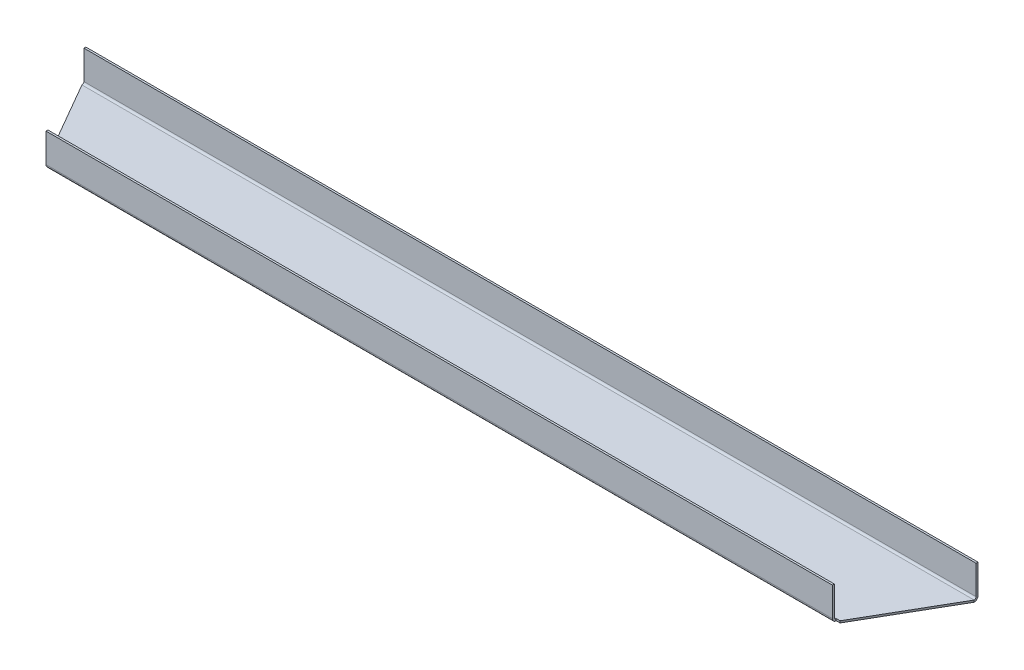
ISO-10303-21;
HEADER;
FILE_DESCRIPTION(('STEP AP214'),'2;1');
FILE_NAME('part.step','',(''),(''),'','','');
FILE_SCHEMA(('AUTOMOTIVE_DESIGN { 1 0 10303 214 1 1 1 1 }'));
ENDSEC;
DATA;
#1=APPLICATION_CONTEXT('core data for automotive mechanical design processes');
#2=APPLICATION_PROTOCOL_DEFINITION('international standard','automotive_design',2000,#1);
#3=PRODUCT_CONTEXT('',#1,'mechanical');
#4=PRODUCT('Part','Part','',(#3));
#5=PRODUCT_RELATED_PRODUCT_CATEGORY('part','',(#4));
#6=PRODUCT_DEFINITION_FORMATION('','',#4);
#7=PRODUCT_DEFINITION_CONTEXT('part definition',#1,'design');
#8=PRODUCT_DEFINITION('design','',#6,#7);
#9=PRODUCT_DEFINITION_SHAPE('','',#8);
#10=(LENGTH_UNIT() NAMED_UNIT(*) SI_UNIT(.MILLI.,.METRE.));
#11=(NAMED_UNIT(*) PLANE_ANGLE_UNIT() SI_UNIT($,.RADIAN.));
#12=(NAMED_UNIT(*) SI_UNIT($,.STERADIAN.) SOLID_ANGLE_UNIT());
#13=UNCERTAINTY_MEASURE_WITH_UNIT(LENGTH_MEASURE(1.E-05),#10,'distance_accuracy_value','');
#14=(GEOMETRIC_REPRESENTATION_CONTEXT(3) GLOBAL_UNCERTAINTY_ASSIGNED_CONTEXT((#13)) GLOBAL_UNIT_ASSIGNED_CONTEXT((#10,
#11,#12)) REPRESENTATION_CONTEXT('',''));
#15=CARTESIAN_POINT('',(0.,0.,0.));
#16=DIRECTION('',(0.,0.,1.));
#17=DIRECTION('',(1.,0.,0.));
#18=AXIS2_PLACEMENT_3D('',#15,#16,#17);
#19=CARTESIAN_POINT('',(-646.229009265076,6.35,149.225));
#20=DIRECTION('',(0.,0.,-1.));
#21=DIRECTION('',(-1.,0.,0.));
#22=AXIS2_PLACEMENT_3D('',#19,#20,#21);
#23=PLANE('',#22);
#24=DIRECTION('',(0.,1.,0.));
#25=VECTOR('',#24,1.);
#26=CARTESIAN_POINT('',(646.229009265076,30.1625,149.225));
#27=LINE('',#26,#25);
#28=CARTESIAN_POINT('',(646.229009265076,53.975,149.225));
#29=VERTEX_POINT('',#28);
#30=CARTESIAN_POINT('',(646.229009265076,6.35,149.225));
#31=VERTEX_POINT('',#30);
#32=EDGE_CURVE('E230',#29,#31,#27,.F.);
#33=ORIENTED_EDGE('',*,*,#32,.T.);
#34=DIRECTION('',(1.,0.,0.));
#35=VECTOR('',#34,1.);
#36=CARTESIAN_POINT('',(-646.229009265076,6.35,149.225));
#37=LINE('',#36,#35);
#38=CARTESIAN_POINT('',(-646.229009265076,6.35,149.225));
#39=VERTEX_POINT('',#38);
#40=EDGE_CURVE('E220',#31,#39,#37,.F.);
#41=ORIENTED_EDGE('',*,*,#40,.T.);
#42=DIRECTION('',(0.,1.,0.));
#43=VECTOR('',#42,1.);
#44=CARTESIAN_POINT('',(-646.229009265076,30.1625,149.225));
#45=LINE('',#44,#43);
#46=CARTESIAN_POINT('',(-646.229009265076,53.975,149.225));
#47=VERTEX_POINT('',#46);
#48=EDGE_CURVE('E221',#39,#47,#45,.T.);
#49=ORIENTED_EDGE('',*,*,#48,.T.);
#50=DIRECTION('',(1.,0.,0.));
#51=VECTOR('',#50,1.);
#52=CARTESIAN_POINT('',(-5.4143356464912E-13,53.975,149.225));
#53=LINE('',#52,#51);
#54=EDGE_CURVE('E231',#47,#29,#53,.T.);
#55=ORIENTED_EDGE('',*,*,#54,.T.);
#56=EDGE_LOOP('',(#33,#41,#49,#55));
#57=FACE_BOUND('',#56,.T.);
#58=ADVANCED_FACE('F33',(#57),#23,.T.);
#59=CARTESIAN_POINT('',(733.234841870792,6.35,3.175));
#60=DIRECTION('',(0.,0.,1.));
#61=DIRECTION('',(1.,0.,0.));
#62=AXIS2_PLACEMENT_3D('',#59,#60,#61);
#63=PLANE('',#62);
#64=DIRECTION('',(0.,1.,0.));
#65=VECTOR('',#64,1.);
#66=CARTESIAN_POINT('',(-733.234841870792,30.1625,3.175));
#67=LINE('',#66,#65);
#68=CARTESIAN_POINT('',(-733.234841870792,53.975,3.175));
#69=VERTEX_POINT('',#68);
#70=CARTESIAN_POINT('',(-733.234841870792,6.35,3.175));
#71=VERTEX_POINT('',#70);
#72=EDGE_CURVE('E247',#69,#71,#67,.F.);
#73=ORIENTED_EDGE('',*,*,#72,.T.);
#74=DIRECTION('',(-1.,0.,0.));
#75=VECTOR('',#74,1.);
#76=CARTESIAN_POINT('',(733.234841870792,6.35,3.175));
#77=LINE('',#76,#75);
#78=CARTESIAN_POINT('',(733.234841870792,6.35,3.175));
#79=VERTEX_POINT('',#78);
#80=EDGE_CURVE('E236',#71,#79,#77,.F.);
#81=ORIENTED_EDGE('',*,*,#80,.T.);
#82=DIRECTION('',(0.,1.,0.));
#83=VECTOR('',#82,1.);
#84=CARTESIAN_POINT('',(733.234841870792,30.1625,3.175));
#85=LINE('',#84,#83);
#86=CARTESIAN_POINT('',(733.234841870792,53.975,3.175));
#87=VERTEX_POINT('',#86);
#88=EDGE_CURVE('E256',#79,#87,#85,.T.);
#89=ORIENTED_EDGE('',*,*,#88,.T.);
#90=DIRECTION('',(1.,0.,0.));
#91=VECTOR('',#90,1.);
#92=CARTESIAN_POINT('',(0.,53.975,3.175));
#93=LINE('',#92,#91);
#94=EDGE_CURVE('E269',#87,#69,#93,.F.);
#95=ORIENTED_EDGE('',*,*,#94,.T.);
#96=EDGE_LOOP('',(#73,#81,#89,#95));
#97=FACE_BOUND('',#96,.T.);
#98=ADVANCED_FACE('F278',(#97),#63,.T.);
#99=CARTESIAN_POINT('',(0.,53.975,1.5875));
#100=DIRECTION('',(0.,-1.,0.));
#101=DIRECTION('',(0.,0.,-1.));
#102=AXIS2_PLACEMENT_3D('',#99,#100,#101);
#103=PLANE('',#102);
#104=DIRECTION('',(0.,0.,-1.));
#105=VECTOR('',#104,1.);
#106=CARTESIAN_POINT('',(-733.234841870792,53.975,1.5875));
#107=LINE('',#106,#105);
#108=CARTESIAN_POINT('',(-733.234841870792,53.975,0.));
#109=VERTEX_POINT('',#108);
#110=EDGE_CURVE('E250',#109,#69,#107,.F.);
#111=ORIENTED_EDGE('',*,*,#110,.T.);
#112=ORIENTED_EDGE('',*,*,#94,.F.);
#113=DIRECTION('',(0.,0.,1.));
#114=VECTOR('',#113,1.);
#115=CARTESIAN_POINT('',(733.234841870792,53.975,1.5875));
#116=LINE('',#115,#114);
#117=CARTESIAN_POINT('',(733.234841870792,53.975,0.));
#118=VERTEX_POINT('',#117);
#119=EDGE_CURVE('E253',#87,#118,#116,.F.);
#120=ORIENTED_EDGE('',*,*,#119,.T.);
#121=DIRECTION('',(1.,0.,0.));
#122=VECTOR('',#121,1.);
#123=CARTESIAN_POINT('',(733.234841870792,53.975,0.));
#124=LINE('',#123,#122);
#125=EDGE_CURVE('E190',#118,#109,#124,.F.);
#126=ORIENTED_EDGE('',*,*,#125,.T.);
#127=EDGE_LOOP('',(#111,#112,#120,#126));
#128=FACE_BOUND('',#127,.T.);
#129=ADVANCED_FACE('F283',(#128),#103,.F.);
#130=CARTESIAN_POINT('',(-5.4143356464912E-13,53.975,150.8125));
#131=DIRECTION('',(0.,-1.,0.));
#132=DIRECTION('',(0.,0.,-1.));
#133=AXIS2_PLACEMENT_3D('',#130,#131,#132);
#134=PLANE('',#133);
#135=DIRECTION('',(0.,0.,1.));
#136=VECTOR('',#135,1.);
#137=CARTESIAN_POINT('',(646.229009265076,53.975,150.8125));
#138=LINE('',#137,#136);
#139=CARTESIAN_POINT('',(646.229009265076,53.975,152.4));
#140=VERTEX_POINT('',#139);
#141=EDGE_CURVE('E227',#140,#29,#138,.F.);
#142=ORIENTED_EDGE('',*,*,#141,.T.);
#143=ORIENTED_EDGE('',*,*,#54,.F.);
#144=DIRECTION('',(0.,0.,-1.));
#145=VECTOR('',#144,1.);
#146=CARTESIAN_POINT('',(-646.229009265076,53.975,150.8125));
#147=LINE('',#146,#145);
#148=CARTESIAN_POINT('',(-646.229009265076,53.975,152.4));
#149=VERTEX_POINT('',#148);
#150=EDGE_CURVE('E218',#47,#149,#147,.F.);
#151=ORIENTED_EDGE('',*,*,#150,.T.);
#152=DIRECTION('',(-1.,0.,0.));
#153=VECTOR('',#152,1.);
#154=CARTESIAN_POINT('',(-646.229009265076,53.975,152.4));
#155=LINE('',#154,#153);
#156=EDGE_CURVE('E147',#149,#140,#155,.F.);
#157=ORIENTED_EDGE('',*,*,#156,.T.);
#158=EDGE_LOOP('',(#142,#143,#151,#157));
#159=FACE_BOUND('',#158,.T.);
#160=ADVANCED_FACE('F436',(#159),#134,.F.);
#161=CARTESIAN_POINT('',(-646.229009265076,6.35,146.05));
#162=DIRECTION('',(1.,0.,0.));
#163=DIRECTION('',(0.,0.,-1.));
#164=AXIS2_PLACEMENT_3D('',#161,#162,#163);
#165=CYLINDRICAL_SURFACE('',#164,3.175);
#166=ORIENTED_EDGE('',*,*,#40,.F.);
#167=CARTESIAN_POINT('',(646.229009265076,6.35,146.05));
#168=DIRECTION('',(1.,0.,0.));
#169=DIRECTION('',(0.,0.,-1.));
#170=AXIS2_PLACEMENT_3D('',#167,#168,#169);
#171=CIRCLE('',#170,3.175);
#172=CARTESIAN_POINT('',(646.229009265076,3.175,146.050000000013));
#173=VERTEX_POINT('',#172);
#174=EDGE_CURVE('E173',#31,#173,#171,.T.);
#175=ORIENTED_EDGE('',*,*,#174,.T.);
#176=DIRECTION('',(1.,0.,0.));
#177=VECTOR('',#176,1.);
#178=CARTESIAN_POINT('',(0.,3.175,146.05));
#179=LINE('',#178,#177);
#180=CARTESIAN_POINT('',(-646.229009265076,3.175,146.050000000013));
#181=VERTEX_POINT('',#180);
#182=EDGE_CURVE('E151',#181,#173,#179,.T.);
#183=ORIENTED_EDGE('',*,*,#182,.F.);
#184=CARTESIAN_POINT('',(-646.229009265076,6.35,146.05));
#185=DIRECTION('',(1.,0.,0.));
#186=DIRECTION('',(0.,0.,-1.));
#187=AXIS2_PLACEMENT_3D('',#184,#185,#186);
#188=CIRCLE('',#187,3.175);
#189=EDGE_CURVE('E176',#181,#39,#188,.F.);
#190=ORIENTED_EDGE('',*,*,#189,.T.);
#191=EDGE_LOOP('',(#166,#175,#183,#190));
#192=FACE_BOUND('',#191,.T.);
#193=ADVANCED_FACE('F445',(#192),#165,.F.);
#194=CARTESIAN_POINT('',(733.234841870792,6.35,6.35));
#195=DIRECTION('',(-1.,0.,0.));
#196=DIRECTION('',(0.,0.,1.));
#197=AXIS2_PLACEMENT_3D('',#194,#195,#196);
#198=CYLINDRICAL_SURFACE('',#197,3.175);
#199=ORIENTED_EDGE('',*,*,#80,.F.);
#200=CARTESIAN_POINT('',(-733.234841870792,6.35,6.35));
#201=DIRECTION('',(-1.,0.,0.));
#202=DIRECTION('',(0.,0.,1.));
#203=AXIS2_PLACEMENT_3D('',#200,#201,#202);
#204=CIRCLE('',#203,3.175);
#205=CARTESIAN_POINT('',(-733.234841870826,3.175,6.35000000006615));
#206=VERTEX_POINT('',#205);
#207=EDGE_CURVE('E178',#71,#206,#204,.T.);
#208=ORIENTED_EDGE('',*,*,#207,.T.);
#209=DIRECTION('',(1.,0.,0.));
#210=VECTOR('',#209,1.);
#211=CARTESIAN_POINT('',(0.,3.175,6.35000000000762));
#212=LINE('',#211,#210);
#213=CARTESIAN_POINT('',(733.234841870826,3.175,6.35000000002227));
#214=VERTEX_POINT('',#213);
#215=EDGE_CURVE('E215',#214,#206,#212,.F.);
#216=ORIENTED_EDGE('',*,*,#215,.F.);
#217=CARTESIAN_POINT('',(733.234841870792,6.35,6.35));
#218=DIRECTION('',(-1.,0.,0.));
#219=DIRECTION('',(0.,0.,1.));
#220=AXIS2_PLACEMENT_3D('',#217,#218,#219);
#221=CIRCLE('',#220,3.175);
#222=EDGE_CURVE('E36',#214,#79,#221,.F.);
#223=ORIENTED_EDGE('',*,*,#222,.T.);
#224=EDGE_LOOP('',(#199,#208,#216,#223));
#225=FACE_BOUND('',#224,.T.);
#226=ADVANCED_FACE('F455',(#225),#198,.F.);
#227=CARTESIAN_POINT('',(733.234841870792,2.9824039545985,2.9824039545985));
#228=DIRECTION('',(-1.,0.,0.));
#229=DIRECTION('',(0.,0.,1.));
#230=AXIS2_PLACEMENT_3D('',#227,#228,#229);
#231=PLANE('',#230);
#232=CARTESIAN_POINT('',(733.234841870792,6.35,6.35));
#233=DIRECTION('',(-1.,0.,0.));
#234=DIRECTION('',(0.,0.,1.));
#235=AXIS2_PLACEMENT_3D('',#232,#233,#234);
#236=CIRCLE('',#235,6.35);
#237=CARTESIAN_POINT('',(733.234841870792,6.35,0.));
#238=VERTEX_POINT('',#237);
#239=CARTESIAN_POINT('',(733.234841870817,0.,6.35000000001495));
#240=VERTEX_POINT('',#239);
#241=EDGE_CURVE('E170',#238,#240,#236,.T.);
#242=ORIENTED_EDGE('',*,*,#241,.F.);
#243=DIRECTION('',(0.,1.,0.));
#244=VECTOR('',#243,1.);
#245=CARTESIAN_POINT('',(733.234841870792,6.35,0.));
#246=LINE('',#245,#244);
#247=EDGE_CURVE('E180',#238,#118,#246,.T.);
#248=ORIENTED_EDGE('',*,*,#247,.T.);
#249=ORIENTED_EDGE('',*,*,#119,.F.);
#250=ORIENTED_EDGE('',*,*,#88,.F.);
#251=ORIENTED_EDGE('',*,*,#222,.F.);
#252=DIRECTION('',(0.,1.,0.));
#253=VECTOR('',#252,1.);
#254=CARTESIAN_POINT('',(733.234841870843,1.5875,6.3500000000369));
#255=LINE('',#254,#253);
#256=EDGE_CURVE('E172',#214,#240,#255,.F.);
#257=ORIENTED_EDGE('',*,*,#256,.T.);
#258=EDGE_LOOP('',(#242,#248,#249,#250,#251,#257));
#259=FACE_BOUND('',#258,.T.);
#260=ADVANCED_FACE('F328',(#259),#231,.F.);
#261=CARTESIAN_POINT('',(733.234841870792,6.35,0.));
#262=DIRECTION('',(0.,0.,1.));
#263=DIRECTION('',(1.,0.,0.));
#264=AXIS2_PLACEMENT_3D('',#261,#262,#263);
#265=PLANE('',#264);
#266=DIRECTION('',(-1.,0.,0.));
#267=VECTOR('',#266,1.);
#268=CARTESIAN_POINT('',(733.234841870792,6.35,0.));
#269=LINE('',#268,#267);
#270=CARTESIAN_POINT('',(-733.234841870792,6.35,0.));
#271=VERTEX_POINT('',#270);
#272=EDGE_CURVE('E169',#271,#238,#269,.F.);
#273=ORIENTED_EDGE('',*,*,#272,.F.);
#274=DIRECTION('',(0.,1.,0.));
#275=VECTOR('',#274,1.);
#276=CARTESIAN_POINT('',(-733.234841870792,6.35,0.));
#277=LINE('',#276,#275);
#278=EDGE_CURVE('E185',#109,#271,#277,.F.);
#279=ORIENTED_EDGE('',*,*,#278,.F.);
#280=ORIENTED_EDGE('',*,*,#125,.F.);
#281=ORIENTED_EDGE('',*,*,#247,.F.);
#282=EDGE_LOOP('',(#273,#279,#280,#281));
#283=FACE_BOUND('',#282,.T.);
#284=ADVANCED_FACE('F286',(#283),#265,.F.);
#285=CARTESIAN_POINT('',(-733.234841870792,2.9824039545985,2.9824039545985));
#286=DIRECTION('',(1.,0.,0.));
#287=DIRECTION('',(0.,0.,-1.));
#288=AXIS2_PLACEMENT_3D('',#285,#286,#287);
#289=PLANE('',#288);
#290=DIRECTION('',(0.,1.,0.));
#291=VECTOR('',#290,1.);
#292=CARTESIAN_POINT('',(-733.234841870843,1.5875,6.3500000000369));
#293=LINE('',#292,#291);
#294=CARTESIAN_POINT('',(-733.234841870817,0.,6.35000000001494));
#295=VERTEX_POINT('',#294);
#296=EDGE_CURVE('E290',#295,#206,#293,.T.);
#297=ORIENTED_EDGE('',*,*,#296,.T.);
#298=ORIENTED_EDGE('',*,*,#207,.F.);
#299=ORIENTED_EDGE('',*,*,#72,.F.);
#300=ORIENTED_EDGE('',*,*,#110,.F.);
#301=ORIENTED_EDGE('',*,*,#278,.T.);
#302=CARTESIAN_POINT('',(-733.234841870792,6.35,6.35));
#303=DIRECTION('',(-1.,0.,0.));
#304=DIRECTION('',(0.,0.,1.));
#305=AXIS2_PLACEMENT_3D('',#302,#303,#304);
#306=CIRCLE('',#305,6.35);
#307=EDGE_CURVE('E167',#295,#271,#306,.F.);
#308=ORIENTED_EDGE('',*,*,#307,.F.);
#309=EDGE_LOOP('',(#297,#298,#299,#300,#301,#308));
#310=FACE_BOUND('',#309,.T.);
#311=ADVANCED_FACE('F281',(#310),#289,.F.);
#312=CARTESIAN_POINT('',(-646.229009265076,2.9824039545985,149.417596045414));
#313=DIRECTION('',(1.,0.,0.));
#314=DIRECTION('',(0.,0.,-1.));
#315=AXIS2_PLACEMENT_3D('',#312,#313,#314);
#316=PLANE('',#315);
#317=CARTESIAN_POINT('',(-646.229009265076,6.35,146.05));
#318=DIRECTION('',(1.,0.,0.));
#319=DIRECTION('',(0.,0.,-1.));
#320=AXIS2_PLACEMENT_3D('',#317,#318,#319);
#321=CIRCLE('',#320,6.35);
#322=CARTESIAN_POINT('',(-646.229009265076,6.35,152.4));
#323=VERTEX_POINT('',#322);
#324=CARTESIAN_POINT('',(-646.229009265076,0.,146.050000000013));
#325=VERTEX_POINT('',#324);
#326=EDGE_CURVE('E50',#323,#325,#321,.T.);
#327=ORIENTED_EDGE('',*,*,#326,.F.);
#328=DIRECTION('',(0.,1.,0.));
#329=VECTOR('',#328,1.);
#330=CARTESIAN_POINT('',(-646.229009265076,6.35,152.4));
#331=LINE('',#330,#329);
#332=EDGE_CURVE('E142',#323,#149,#331,.T.);
#333=ORIENTED_EDGE('',*,*,#332,.T.);
#334=ORIENTED_EDGE('',*,*,#150,.F.);
#335=ORIENTED_EDGE('',*,*,#48,.F.);
#336=ORIENTED_EDGE('',*,*,#189,.F.);
#337=DIRECTION('',(0.,1.,0.));
#338=VECTOR('',#337,1.);
#339=CARTESIAN_POINT('',(-646.229009265076,1.5875,146.050000000025));
#340=LINE('',#339,#338);
#341=EDGE_CURVE('E159',#181,#325,#340,.F.);
#342=ORIENTED_EDGE('',*,*,#341,.T.);
#343=EDGE_LOOP('',(#327,#333,#334,#335,#336,#342));
#344=FACE_BOUND('',#343,.T.);
#345=ADVANCED_FACE('F157',(#344),#316,.F.);
#346=CARTESIAN_POINT('',(646.229009265076,2.9824039545985,149.417596045414));
#347=DIRECTION('',(-1.,0.,0.));
#348=DIRECTION('',(0.,0.,1.));
#349=AXIS2_PLACEMENT_3D('',#346,#347,#348);
#350=PLANE('',#349);
#351=DIRECTION('',(0.,1.,0.));
#352=VECTOR('',#351,1.);
#353=CARTESIAN_POINT('',(646.229009265076,1.5875,146.050000000025));
#354=LINE('',#353,#352);
#355=CARTESIAN_POINT('',(646.229009265076,0.,146.050000000013));
#356=VERTEX_POINT('',#355);
#357=EDGE_CURVE('E211',#356,#173,#354,.T.);
#358=ORIENTED_EDGE('',*,*,#357,.T.);
#359=ORIENTED_EDGE('',*,*,#174,.F.);
#360=ORIENTED_EDGE('',*,*,#32,.F.);
#361=ORIENTED_EDGE('',*,*,#141,.F.);
#362=DIRECTION('',(0.,1.,0.));
#363=VECTOR('',#362,1.);
#364=CARTESIAN_POINT('',(646.229009265076,6.35,152.4));
#365=LINE('',#364,#363);
#366=CARTESIAN_POINT('',(646.229009265076,6.35,152.4));
#367=VERTEX_POINT('',#366);
#368=EDGE_CURVE('E152',#140,#367,#365,.F.);
#369=ORIENTED_EDGE('',*,*,#368,.T.);
#370=CARTESIAN_POINT('',(646.229009265076,6.35,146.05));
#371=DIRECTION('',(1.,0.,0.));
#372=DIRECTION('',(0.,0.,-1.));
#373=AXIS2_PLACEMENT_3D('',#370,#371,#372);
#374=CIRCLE('',#373,6.35);
#375=EDGE_CURVE('E136',#356,#367,#374,.F.);
#376=ORIENTED_EDGE('',*,*,#375,.F.);
#377=EDGE_LOOP('',(#358,#359,#360,#361,#369,#376));
#378=FACE_BOUND('',#377,.T.);
#379=ADVANCED_FACE('F343',(#378),#350,.F.);
#380=CARTESIAN_POINT('',(-646.229009265076,6.35,152.4));
#381=DIRECTION('',(0.,0.,-1.));
#382=DIRECTION('',(-1.,0.,0.));
#383=AXIS2_PLACEMENT_3D('',#380,#381,#382);
#384=PLANE('',#383);
#385=DIRECTION('',(1.,0.,0.));
#386=VECTOR('',#385,1.);
#387=CARTESIAN_POINT('',(-646.229009265076,6.35,152.4));
#388=LINE('',#387,#386);
#389=EDGE_CURVE('E145',#367,#323,#388,.F.);
#390=ORIENTED_EDGE('',*,*,#389,.F.);
#391=ORIENTED_EDGE('',*,*,#368,.F.);
#392=ORIENTED_EDGE('',*,*,#156,.F.);
#393=ORIENTED_EDGE('',*,*,#332,.F.);
#394=EDGE_LOOP('',(#390,#391,#392,#393));
#395=FACE_BOUND('',#394,.T.);
#396=ADVANCED_FACE('F143',(#395),#384,.F.);
#397=CARTESIAN_POINT('',(0.,3.175,0.));
#398=DIRECTION('',(0.,1.,0.));
#399=DIRECTION('',(0.,0.,1.));
#400=AXIS2_PLACEMENT_3D('',#397,#398,#399);
#401=PLANE('',#400);
#402=DIRECTION('',(-0.500000000000017,0.,-0.866025403784429));
#403=VECTOR('',#402,1.);
#404=CARTESIAN_POINT('',(-694.740012672644,3.175,73.025));
#405=LINE('',#404,#403);
#406=CARTESIAN_POINT('',(-652.579009265071,3.175,146.050000000022));
#407=VERTEX_POINT('',#406);
#408=EDGE_CURVE('E323',#206,#407,#405,.F.);
#409=ORIENTED_EDGE('',*,*,#408,.T.);
#410=DIRECTION('',(-1.,0.,0.));
#411=VECTOR('',#410,1.);
#412=CARTESIAN_POINT('',(-649.404009265076,3.175,146.050000000025));
#413=LINE('',#412,#411);
#414=EDGE_CURVE('E163',#407,#181,#413,.F.);
#415=ORIENTED_EDGE('',*,*,#414,.T.);
#416=ORIENTED_EDGE('',*,*,#182,.T.);
#417=DIRECTION('',(-1.,0.,0.));
#418=VECTOR('',#417,1.);
#419=CARTESIAN_POINT('',(649.404009265076,3.175,146.050000000025));
#420=LINE('',#419,#418);
#421=CARTESIAN_POINT('',(652.579009265065,3.175,146.050000000019));
#422=VERTEX_POINT('',#421);
#423=EDGE_CURVE('E105',#173,#422,#420,.F.);
#424=ORIENTED_EDGE('',*,*,#423,.T.);
#425=DIRECTION('',(-0.500000000000017,0.,0.866025403784429));
#426=VECTOR('',#425,1.);
#427=CARTESIAN_POINT('',(694.740012672644,3.175,73.025));
#428=LINE('',#427,#426);
#429=EDGE_CURVE('E198',#422,#214,#428,.F.);
#430=ORIENTED_EDGE('',*,*,#429,.T.);
#431=ORIENTED_EDGE('',*,*,#215,.T.);
#432=EDGE_LOOP('',(#409,#415,#416,#424,#430,#431));
#433=FACE_BOUND('',#432,.T.);
#434=ADVANCED_FACE('F333',(#433),#401,.T.);
#435=CARTESIAN_POINT('',(649.404009265076,1.5875,146.050000000025));
#436=DIRECTION('',(0.,0.,-1.));
#437=DIRECTION('',(-1.,0.,0.));
#438=AXIS2_PLACEMENT_3D('',#435,#436,#437);
#439=PLANE('',#438);
#440=DIRECTION('',(1.,0.,0.));
#441=VECTOR('',#440,1.);
#442=CARTESIAN_POINT('',(0.,0.,146.05));
#443=LINE('',#442,#441);
#444=CARTESIAN_POINT('',(652.579009265072,0.,146.050000000012));
#445=VERTEX_POINT('',#444);
#446=EDGE_CURVE('E155',#356,#445,#443,.T.);
#447=ORIENTED_EDGE('',*,*,#446,.T.);
#448=DIRECTION('',(0.,1.,0.));
#449=VECTOR('',#448,1.);
#450=CARTESIAN_POINT('',(652.57900926506,1.5875,146.050000000016));
#451=LINE('',#450,#449);
#452=EDGE_CURVE('E206',#445,#422,#451,.T.);
#453=ORIENTED_EDGE('',*,*,#452,.T.);
#454=ORIENTED_EDGE('',*,*,#423,.F.);
#455=ORIENTED_EDGE('',*,*,#357,.F.);
#456=EDGE_LOOP('',(#447,#453,#454,#455));
#457=FACE_BOUND('',#456,.T.);
#458=ADVANCED_FACE('F335',(#457),#439,.F.);
#459=CARTESIAN_POINT('',(694.740012672644,1.5875,73.025));
#460=DIRECTION('',(-0.866025403784429,0.,-0.500000000000017));
#461=DIRECTION('',(-0.500000000000017,0.,0.866025403784429));
#462=AXIS2_PLACEMENT_3D('',#459,#460,#461);
#463=PLANE('',#462);
#464=ORIENTED_EDGE('',*,*,#429,.F.);
#465=ORIENTED_EDGE('',*,*,#452,.F.);
#466=DIRECTION('',(0.499999999999605,0.,-0.866025403784667));
#467=VECTOR('',#466,1.);
#468=CARTESIAN_POINT('',(652.579009265076,0.,146.050000000025));
#469=LINE('',#468,#467);
#470=EDGE_CURVE('E199',#445,#240,#469,.T.);
#471=ORIENTED_EDGE('',*,*,#470,.T.);
#472=ORIENTED_EDGE('',*,*,#256,.F.);
#473=EDGE_LOOP('',(#464,#465,#471,#472));
#474=FACE_BOUND('',#473,.T.);
#475=ADVANCED_FACE('F331',(#474),#463,.F.);
#476=CARTESIAN_POINT('',(733.234841870792,6.35,6.35));
#477=DIRECTION('',(-1.,0.,0.));
#478=DIRECTION('',(0.,0.,1.));
#479=AXIS2_PLACEMENT_3D('',#476,#477,#478);
#480=CYLINDRICAL_SURFACE('',#479,6.35);
#481=ORIENTED_EDGE('',*,*,#307,.T.);
#482=ORIENTED_EDGE('',*,*,#272,.T.);
#483=ORIENTED_EDGE('',*,*,#241,.T.);
#484=DIRECTION('',(1.,0.,0.));
#485=VECTOR('',#484,1.);
#486=CARTESIAN_POINT('',(0.,0.,6.35000000000762));
#487=LINE('',#486,#485);
#488=EDGE_CURVE('E202',#240,#295,#487,.F.);
#489=ORIENTED_EDGE('',*,*,#488,.T.);
#490=EDGE_LOOP('',(#481,#482,#483,#489));
#491=FACE_BOUND('',#490,.T.);
#492=ADVANCED_FACE('F304',(#491),#480,.T.);
#493=CARTESIAN_POINT('',(-694.740012672644,1.5875,73.025));
#494=DIRECTION('',(0.866025403784429,0.,-0.500000000000017));
#495=DIRECTION('',(-0.500000000000017,0.,-0.866025403784429));
#496=AXIS2_PLACEMENT_3D('',#493,#494,#495);
#497=PLANE('',#496);
#498=DIRECTION('',(0.499999999999605,0.,0.866025403784667));
#499=VECTOR('',#498,1.);
#500=CARTESIAN_POINT('',(-733.234841870792,0.,6.35000000000762));
#501=LINE('',#500,#499);
#502=CARTESIAN_POINT('',(-652.579009265072,0.,146.050000000025));
#503=VERTEX_POINT('',#502);
#504=EDGE_CURVE('E297',#295,#503,#501,.T.);
#505=ORIENTED_EDGE('',*,*,#504,.T.);
#506=DIRECTION('',(0.,1.,0.));
#507=VECTOR('',#506,1.);
#508=CARTESIAN_POINT('',(-652.579009265076,1.5875,146.050000000025));
#509=LINE('',#508,#507);
#510=EDGE_CURVE('E319',#503,#407,#509,.T.);
#511=ORIENTED_EDGE('',*,*,#510,.T.);
#512=ORIENTED_EDGE('',*,*,#408,.F.);
#513=ORIENTED_EDGE('',*,*,#296,.F.);
#514=EDGE_LOOP('',(#505,#511,#512,#513));
#515=FACE_BOUND('',#514,.T.);
#516=ADVANCED_FACE('F355',(#515),#497,.F.);
#517=CARTESIAN_POINT('',(-649.404009265076,1.5875,146.050000000025));
#518=DIRECTION('',(0.,0.,-1.));
#519=DIRECTION('',(-1.,0.,0.));
#520=AXIS2_PLACEMENT_3D('',#517,#518,#519);
#521=PLANE('',#520);
#522=ORIENTED_EDGE('',*,*,#414,.F.);
#523=ORIENTED_EDGE('',*,*,#510,.F.);
#524=DIRECTION('',(1.,0.,0.));
#525=VECTOR('',#524,1.);
#526=CARTESIAN_POINT('',(0.,0.,146.050000000025));
#527=LINE('',#526,#525);
#528=EDGE_CURVE('E42',#503,#325,#527,.T.);
#529=ORIENTED_EDGE('',*,*,#528,.T.);
#530=ORIENTED_EDGE('',*,*,#341,.F.);
#531=EDGE_LOOP('',(#522,#523,#529,#530));
#532=FACE_BOUND('',#531,.T.);
#533=ADVANCED_FACE('F350',(#532),#521,.F.);
#534=CARTESIAN_POINT('',(-646.229009265076,6.35,146.05));
#535=DIRECTION('',(1.,0.,0.));
#536=DIRECTION('',(0.,0.,-1.));
#537=AXIS2_PLACEMENT_3D('',#534,#535,#536);
#538=CYLINDRICAL_SURFACE('',#537,6.35);
#539=ORIENTED_EDGE('',*,*,#375,.T.);
#540=ORIENTED_EDGE('',*,*,#389,.T.);
#541=ORIENTED_EDGE('',*,*,#326,.T.);
#542=DIRECTION('',(1.,0.,0.));
#543=VECTOR('',#542,1.);
#544=CARTESIAN_POINT('',(0.,0.,146.05));
#545=LINE('',#544,#543);
#546=EDGE_CURVE('E11',#325,#356,#545,.T.);
#547=ORIENTED_EDGE('',*,*,#546,.T.);
#548=EDGE_LOOP('',(#539,#540,#541,#547));
#549=FACE_BOUND('',#548,.T.);
#550=ADVANCED_FACE('F154',(#549),#538,.T.);
#551=CARTESIAN_POINT('',(0.,0.,0.));
#552=DIRECTION('',(0.,1.,0.));
#553=DIRECTION('',(0.,0.,1.));
#554=AXIS2_PLACEMENT_3D('',#551,#552,#553);
#555=PLANE('',#554);
#556=ORIENTED_EDGE('',*,*,#528,.F.);
#557=ORIENTED_EDGE('',*,*,#504,.F.);
#558=ORIENTED_EDGE('',*,*,#488,.F.);
#559=ORIENTED_EDGE('',*,*,#470,.F.);
#560=ORIENTED_EDGE('',*,*,#446,.F.);
#561=ORIENTED_EDGE('',*,*,#546,.F.);
#562=EDGE_LOOP('',(#556,#557,#558,#559,#560,#561));
#563=FACE_BOUND('',#562,.T.);
#564=ADVANCED_FACE('F298',(#563),#555,.F.);
#565=CLOSED_SHELL('',(#58,#98,#129,#160,#193,#226,#260,#284,#311,#345,#379,#396,#434,#458,#475,
#492,#516,#533,#550,#564));
#566=MANIFOLD_SOLID_BREP('B2',#565);
#567=ADVANCED_BREP_SHAPE_REPRESENTATION('',(#18,#566),#14);
#568=SHAPE_DEFINITION_REPRESENTATION(#9,#567);
ENDSEC;
END-ISO-10303-21;
